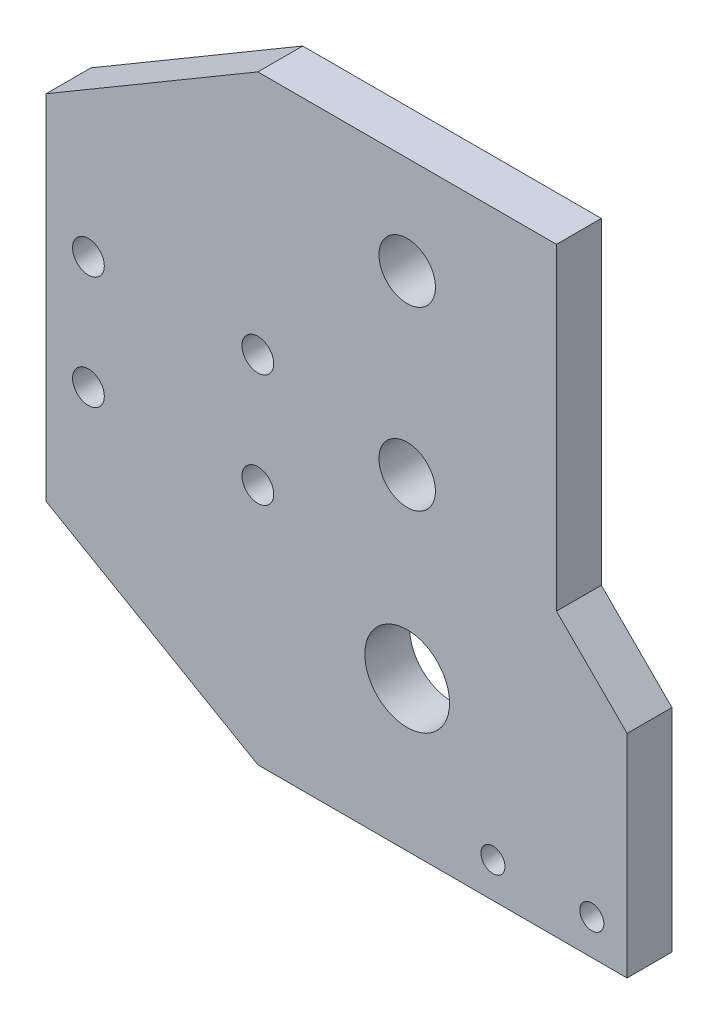
ISO-10303-21;
HEADER;
FILE_DESCRIPTION(('STEP AP214'),'2;1');
FILE_NAME('part.step','',(''),(''),'','','');
FILE_SCHEMA(('AUTOMOTIVE_DESIGN { 1 0 10303 214 1 1 1 1 }'));
ENDSEC;
DATA;
#1=APPLICATION_CONTEXT('core data for automotive mechanical design processes');
#2=APPLICATION_PROTOCOL_DEFINITION('international standard','automotive_design',2000,#1);
#3=PRODUCT_CONTEXT('',#1,'mechanical');
#4=PRODUCT('Part','Part','',(#3));
#5=PRODUCT_RELATED_PRODUCT_CATEGORY('part','',(#4));
#6=PRODUCT_DEFINITION_FORMATION('','',#4);
#7=PRODUCT_DEFINITION_CONTEXT('part definition',#1,'design');
#8=PRODUCT_DEFINITION('design','',#6,#7);
#9=PRODUCT_DEFINITION_SHAPE('','',#8);
#10=(LENGTH_UNIT() NAMED_UNIT(*) SI_UNIT(.MILLI.,.METRE.));
#11=(NAMED_UNIT(*) PLANE_ANGLE_UNIT() SI_UNIT($,.RADIAN.));
#12=(NAMED_UNIT(*) SI_UNIT($,.STERADIAN.) SOLID_ANGLE_UNIT());
#13=UNCERTAINTY_MEASURE_WITH_UNIT(LENGTH_MEASURE(1.E-05),#10,'distance_accuracy_value','');
#14=(GEOMETRIC_REPRESENTATION_CONTEXT(3) GLOBAL_UNCERTAINTY_ASSIGNED_CONTEXT((#13)) GLOBAL_UNIT_ASSIGNED_CONTEXT((#10,
#11,#12)) REPRESENTATION_CONTEXT('',''));
#15=CARTESIAN_POINT('',(0.,0.,0.));
#16=DIRECTION('',(0.,0.,1.));
#17=DIRECTION('',(1.,0.,0.));
#18=AXIS2_PLACEMENT_3D('',#15,#16,#17);
#19=CARTESIAN_POINT('',(21.15,-21.15,6.35));
#20=DIRECTION('',(-1.,0.,0.));
#21=DIRECTION('',(0.,-1.,0.));
#22=AXIS2_PLACEMENT_3D('',#19,#20,#21);
#23=PLANE('',#22);
#24=DIRECTION('',(0.,0.,1.));
#25=VECTOR('',#24,1.);
#26=CARTESIAN_POINT('',(21.15,18.8500000000001,-41.2310562561767));
#27=LINE('',#26,#25);
#28=CARTESIAN_POINT('',(21.15,18.8500000000001,0.));
#29=VERTEX_POINT('',#28);
#30=CARTESIAN_POINT('',(21.15,18.8500000000001,6.35));
#31=VERTEX_POINT('',#30);
#32=EDGE_CURVE('E61',#29,#31,#27,.T.);
#33=ORIENTED_EDGE('',*,*,#32,.F.);
#34=DIRECTION('',(0.,1.,0.));
#35=VECTOR('',#34,1.);
#36=CARTESIAN_POINT('',(21.15,-21.15,0.));
#37=LINE('',#36,#35);
#38=CARTESIAN_POINT('',(21.15,63.85,0.));
#39=VERTEX_POINT('',#38);
#40=EDGE_CURVE('E81',#29,#39,#37,.T.);
#41=ORIENTED_EDGE('',*,*,#40,.T.);
#42=DIRECTION('',(0.,0.,-1.));
#43=VECTOR('',#42,1.);
#44=CARTESIAN_POINT('',(21.15,63.85,6.35));
#45=LINE('',#44,#43);
#46=CARTESIAN_POINT('',(21.15,63.85,6.35));
#47=VERTEX_POINT('',#46);
#48=EDGE_CURVE('E54',#47,#39,#45,.T.);
#49=ORIENTED_EDGE('',*,*,#48,.F.);
#50=DIRECTION('',(0.,1.,0.));
#51=VECTOR('',#50,1.);
#52=CARTESIAN_POINT('',(21.15,-21.15,6.35));
#53=LINE('',#52,#51);
#54=EDGE_CURVE('E234',#31,#47,#53,.T.);
#55=ORIENTED_EDGE('',*,*,#54,.F.);
#56=EDGE_LOOP('',(#33,#41,#49,#55));
#57=FACE_BOUND('',#56,.T.);
#58=ADVANCED_FACE('F45',(#57),#23,.F.);
#59=CARTESIAN_POINT('',(0.,0.,6.35));
#60=DIRECTION('',(0.,0.,-1.));
#61=DIRECTION('',(-1.,0.,0.));
#62=AXIS2_PLACEMENT_3D('',#59,#60,#61);
#63=PLANE('',#62);
#64=CARTESIAN_POINT('',(12.15,-16.15,6.35));
#65=DIRECTION('',(0.,0.,1.));
#66=DIRECTION('',(1.,0.,0.));
#67=AXIS2_PLACEMENT_3D('',#64,#65,#66);
#68=CIRCLE('',#67,1.69999999999999);
#69=CARTESIAN_POINT('',(13.85,-16.15,6.35));
#70=VERTEX_POINT('',#69);
#71=EDGE_CURVE('E443',#70,#70,#68,.T.);
#72=ORIENTED_EDGE('',*,*,#71,.F.);
#73=EDGE_LOOP('',(#72));
#74=FACE_BOUND('',#73,.T.);
#75=CARTESIAN_POINT('',(26.15,-16.15,6.35));
#76=DIRECTION('',(0.,0.,1.));
#77=DIRECTION('',(1.,0.,0.));
#78=AXIS2_PLACEMENT_3D('',#75,#76,#77);
#79=CIRCLE('',#78,1.69999999999999);
#80=CARTESIAN_POINT('',(27.85,-16.15,6.35));
#81=VERTEX_POINT('',#80);
#82=EDGE_CURVE('E447',#81,#81,#79,.T.);
#83=ORIENTED_EDGE('',*,*,#82,.F.);
#84=EDGE_LOOP('',(#83));
#85=FACE_BOUND('',#84,.T.);
#86=CARTESIAN_POINT('',(-21.15,29.170508075689,6.35));
#87=DIRECTION('',(0.,0.,1.));
#88=DIRECTION('',(1.,0.,0.));
#89=AXIS2_PLACEMENT_3D('',#86,#87,#88);
#90=CIRCLE('',#89,2.25);
#91=CARTESIAN_POINT('',(-18.9,29.170508075689,6.35));
#92=VERTEX_POINT('',#91);
#93=EDGE_CURVE('E149',#92,#92,#90,.T.);
#94=ORIENTED_EDGE('',*,*,#93,.F.);
#95=EDGE_LOOP('',(#94));
#96=FACE_BOUND('',#95,.T.);
#97=CARTESIAN_POINT('',(-45.15,13.1705080756889,6.35));
#98=DIRECTION('',(0.,0.,1.));
#99=DIRECTION('',(1.,0.,0.));
#100=AXIS2_PLACEMENT_3D('',#97,#98,#99);
#101=CIRCLE('',#100,2.25);
#102=CARTESIAN_POINT('',(-42.9,13.1705080756889,6.35));
#103=VERTEX_POINT('',#102);
#104=EDGE_CURVE('E157',#103,#103,#101,.T.);
#105=ORIENTED_EDGE('',*,*,#104,.F.);
#106=EDGE_LOOP('',(#105));
#107=FACE_BOUND('',#106,.T.);
#108=CARTESIAN_POINT('',(-45.15,29.170508075689,6.35));
#109=DIRECTION('',(0.,0.,1.));
#110=DIRECTION('',(1.,0.,0.));
#111=AXIS2_PLACEMENT_3D('',#108,#109,#110);
#112=CIRCLE('',#111,2.25);
#113=CARTESIAN_POINT('',(-42.9,29.170508075689,6.35));
#114=VERTEX_POINT('',#113);
#115=EDGE_CURVE('E165',#114,#114,#112,.T.);
#116=ORIENTED_EDGE('',*,*,#115,.F.);
#117=EDGE_LOOP('',(#116));
#118=FACE_BOUND('',#117,.T.);
#119=CARTESIAN_POINT('',(-21.15,13.170508075689,6.35));
#120=DIRECTION('',(0.,0.,1.));
#121=DIRECTION('',(1.,0.,0.));
#122=AXIS2_PLACEMENT_3D('',#119,#120,#121);
#123=CIRCLE('',#122,2.25);
#124=CARTESIAN_POINT('',(-18.9,13.170508075689,6.35));
#125=VERTEX_POINT('',#124);
#126=EDGE_CURVE('E173',#125,#125,#123,.T.);
#127=ORIENTED_EDGE('',*,*,#126,.F.);
#128=EDGE_LOOP('',(#127));
#129=FACE_BOUND('',#128,.T.);
#130=DIRECTION('',(-1.,0.,0.));
#131=VECTOR('',#130,1.);
#132=CARTESIAN_POINT('',(-21.15,63.85,6.35));
#133=LINE('',#132,#131);
#134=CARTESIAN_POINT('',(-21.15,63.85,6.35));
#135=VERTEX_POINT('',#134);
#136=EDGE_CURVE('E70',#47,#135,#133,.T.);
#137=ORIENTED_EDGE('',*,*,#136,.T.);
#138=DIRECTION('',(-0.861526899004657,-0.507711928450986,0.));
#139=VECTOR('',#138,1.);
#140=CARTESIAN_POINT('',(-51.15,46.170508075689,6.35));
#141=LINE('',#140,#139);
#142=CARTESIAN_POINT('',(-51.15,46.170508075689,6.35));
#143=VERTEX_POINT('',#142);
#144=EDGE_CURVE('E181',#135,#143,#141,.T.);
#145=ORIENTED_EDGE('',*,*,#144,.T.);
#146=DIRECTION('',(0.,-1.,0.));
#147=VECTOR('',#146,1.);
#148=CARTESIAN_POINT('',(-51.15,-3.82949192431105,6.35));
#149=LINE('',#148,#147);
#150=CARTESIAN_POINT('',(-51.15,-3.82949192431105,6.35));
#151=VERTEX_POINT('',#150);
#152=EDGE_CURVE('E187',#143,#151,#149,.T.);
#153=ORIENTED_EDGE('',*,*,#152,.T.);
#154=DIRECTION('',(0.866025403784436,-0.500000000000004,0.));
#155=VECTOR('',#154,1.);
#156=CARTESIAN_POINT('',(-21.15,-21.15,6.35));
#157=LINE('',#156,#155);
#158=CARTESIAN_POINT('',(-21.15,-21.15,6.35));
#159=VERTEX_POINT('',#158);
#160=EDGE_CURVE('E182',#151,#159,#157,.T.);
#161=ORIENTED_EDGE('',*,*,#160,.T.);
#162=DIRECTION('',(1.,0.,0.));
#163=VECTOR('',#162,1.);
#164=CARTESIAN_POINT('',(-21.15,-21.15,6.35));
#165=LINE('',#164,#163);
#166=CARTESIAN_POINT('',(31.15,-21.15,6.35));
#167=VERTEX_POINT('',#166);
#168=EDGE_CURVE('E87',#159,#167,#165,.T.);
#169=ORIENTED_EDGE('',*,*,#168,.T.);
#170=DIRECTION('',(0.,1.,0.));
#171=VECTOR('',#170,1.);
#172=CARTESIAN_POINT('',(31.15,-21.15,6.35));
#173=LINE('',#172,#171);
#174=CARTESIAN_POINT('',(31.15,8.85,6.35));
#175=VERTEX_POINT('',#174);
#176=EDGE_CURVE('E139',#167,#175,#173,.T.);
#177=ORIENTED_EDGE('',*,*,#176,.T.);
#178=DIRECTION('',(-0.707106781186544,0.707106781186551,0.));
#179=VECTOR('',#178,1.);
#180=CARTESIAN_POINT('',(31.15,8.85,6.35));
#181=LINE('',#180,#179);
#182=EDGE_CURVE('E141',#175,#31,#181,.T.);
#183=ORIENTED_EDGE('',*,*,#182,.T.);
#184=ORIENTED_EDGE('',*,*,#54,.T.);
#185=EDGE_LOOP('',(#137,#145,#153,#161,#169,#177,#183,#184));
#186=FACE_BOUND('',#185,.T.);
#187=CARTESIAN_POINT('',(0.,0.,6.35));
#188=DIRECTION('',(0.,0.,1.));
#189=DIRECTION('',(1.,0.,0.));
#190=AXIS2_PLACEMENT_3D('',#187,#188,#189);
#191=CIRCLE('',#190,6.);
#192=CARTESIAN_POINT('',(6.,0.,6.35));
#193=VERTEX_POINT('',#192);
#194=EDGE_CURVE('E124',#193,#193,#191,.T.);
#195=ORIENTED_EDGE('',*,*,#194,.F.);
#196=EDGE_LOOP('',(#195));
#197=FACE_BOUND('',#196,.T.);
#198=CARTESIAN_POINT('',(0.,25.,6.35));
#199=DIRECTION('',(0.,0.,1.));
#200=DIRECTION('',(1.,0.,0.));
#201=AXIS2_PLACEMENT_3D('',#198,#199,#200);
#202=CIRCLE('',#201,4.);
#203=CARTESIAN_POINT('',(4.,25.,6.35));
#204=VERTEX_POINT('',#203);
#205=EDGE_CURVE('E218',#204,#204,#202,.T.);
#206=ORIENTED_EDGE('',*,*,#205,.F.);
#207=EDGE_LOOP('',(#206));
#208=FACE_BOUND('',#207,.T.);
#209=CARTESIAN_POINT('',(0.,50.,6.35));
#210=DIRECTION('',(0.,0.,1.));
#211=DIRECTION('',(1.,0.,0.));
#212=AXIS2_PLACEMENT_3D('',#209,#210,#211);
#213=CIRCLE('',#212,4.);
#214=CARTESIAN_POINT('',(4.,50.,6.35));
#215=VERTEX_POINT('',#214);
#216=EDGE_CURVE('E210',#215,#215,#213,.T.);
#217=ORIENTED_EDGE('',*,*,#216,.F.);
#218=EDGE_LOOP('',(#217));
#219=FACE_BOUND('',#218,.T.);
#220=ADVANCED_FACE('F257',(#74,#85,#96,#107,#118,#129,#186,#197,#208,#219),#63,.F.);
#221=CARTESIAN_POINT('',(0.,0.,0.));
#222=DIRECTION('',(0.,0.,-1.));
#223=DIRECTION('',(-1.,0.,0.));
#224=AXIS2_PLACEMENT_3D('',#221,#222,#223);
#225=PLANE('',#224);
#226=CARTESIAN_POINT('',(12.15,-16.15,0.));
#227=DIRECTION('',(0.,0.,1.));
#228=DIRECTION('',(1.,0.,0.));
#229=AXIS2_PLACEMENT_3D('',#226,#227,#228);
#230=CIRCLE('',#229,1.7);
#231=CARTESIAN_POINT('',(13.85,-16.15,0.));
#232=VERTEX_POINT('',#231);
#233=EDGE_CURVE('E440',#232,#232,#230,.T.);
#234=ORIENTED_EDGE('',*,*,#233,.T.);
#235=EDGE_LOOP('',(#234));
#236=FACE_BOUND('',#235,.T.);
#237=CARTESIAN_POINT('',(26.15,-16.15,0.));
#238=DIRECTION('',(0.,0.,1.));
#239=DIRECTION('',(1.,0.,0.));
#240=AXIS2_PLACEMENT_3D('',#237,#238,#239);
#241=CIRCLE('',#240,1.7);
#242=CARTESIAN_POINT('',(27.85,-16.15,0.));
#243=VERTEX_POINT('',#242);
#244=EDGE_CURVE('E453',#243,#243,#241,.T.);
#245=ORIENTED_EDGE('',*,*,#244,.T.);
#246=EDGE_LOOP('',(#245));
#247=FACE_BOUND('',#246,.T.);
#248=CARTESIAN_POINT('',(-21.15,29.170508075689,0.));
#249=DIRECTION('',(0.,0.,1.));
#250=DIRECTION('',(1.,0.,0.));
#251=AXIS2_PLACEMENT_3D('',#248,#249,#250);
#252=CIRCLE('',#251,2.25);
#253=CARTESIAN_POINT('',(-18.9,29.170508075689,0.));
#254=VERTEX_POINT('',#253);
#255=EDGE_CURVE('E153',#254,#254,#252,.T.);
#256=ORIENTED_EDGE('',*,*,#255,.T.);
#257=EDGE_LOOP('',(#256));
#258=FACE_BOUND('',#257,.T.);
#259=CARTESIAN_POINT('',(-45.15,13.1705080756889,0.));
#260=DIRECTION('',(0.,0.,1.));
#261=DIRECTION('',(1.,0.,0.));
#262=AXIS2_PLACEMENT_3D('',#259,#260,#261);
#263=CIRCLE('',#262,2.25);
#264=CARTESIAN_POINT('',(-42.9,13.1705080756889,0.));
#265=VERTEX_POINT('',#264);
#266=EDGE_CURVE('E161',#265,#265,#263,.T.);
#267=ORIENTED_EDGE('',*,*,#266,.T.);
#268=EDGE_LOOP('',(#267));
#269=FACE_BOUND('',#268,.T.);
#270=CARTESIAN_POINT('',(-45.15,29.170508075689,0.));
#271=DIRECTION('',(0.,0.,1.));
#272=DIRECTION('',(1.,0.,0.));
#273=AXIS2_PLACEMENT_3D('',#270,#271,#272);
#274=CIRCLE('',#273,2.25);
#275=CARTESIAN_POINT('',(-42.9,29.170508075689,0.));
#276=VERTEX_POINT('',#275);
#277=EDGE_CURVE('E169',#276,#276,#274,.T.);
#278=ORIENTED_EDGE('',*,*,#277,.T.);
#279=EDGE_LOOP('',(#278));
#280=FACE_BOUND('',#279,.T.);
#281=CARTESIAN_POINT('',(-21.15,13.170508075689,0.));
#282=DIRECTION('',(0.,0.,1.));
#283=DIRECTION('',(1.,0.,0.));
#284=AXIS2_PLACEMENT_3D('',#281,#282,#283);
#285=CIRCLE('',#284,2.25);
#286=CARTESIAN_POINT('',(-18.9,13.170508075689,0.));
#287=VERTEX_POINT('',#286);
#288=EDGE_CURVE('E177',#287,#287,#285,.T.);
#289=ORIENTED_EDGE('',*,*,#288,.T.);
#290=EDGE_LOOP('',(#289));
#291=FACE_BOUND('',#290,.T.);
#292=CARTESIAN_POINT('',(0.,25.,0.));
#293=DIRECTION('',(0.,0.,1.));
#294=DIRECTION('',(1.,0.,0.));
#295=AXIS2_PLACEMENT_3D('',#292,#293,#294);
#296=CIRCLE('',#295,4.);
#297=CARTESIAN_POINT('',(4.,25.,0.));
#298=VERTEX_POINT('',#297);
#299=EDGE_CURVE('E214',#298,#298,#296,.T.);
#300=ORIENTED_EDGE('',*,*,#299,.T.);
#301=EDGE_LOOP('',(#300));
#302=FACE_BOUND('',#301,.T.);
#303=DIRECTION('',(1.,0.,0.));
#304=VECTOR('',#303,1.);
#305=CARTESIAN_POINT('',(-21.15,-21.15,0.));
#306=LINE('',#305,#304);
#307=CARTESIAN_POINT('',(-21.15,-21.15,0.));
#308=VERTEX_POINT('',#307);
#309=CARTESIAN_POINT('',(31.15,-21.15,0.));
#310=VERTEX_POINT('',#309);
#311=EDGE_CURVE('E116',#308,#310,#306,.T.);
#312=ORIENTED_EDGE('',*,*,#311,.F.);
#313=DIRECTION('',(0.866025403784436,-0.500000000000004,0.));
#314=VECTOR('',#313,1.);
#315=CARTESIAN_POINT('',(-21.15,-21.15,0.));
#316=LINE('',#315,#314);
#317=CARTESIAN_POINT('',(-51.15,-3.82949192431105,0.));
#318=VERTEX_POINT('',#317);
#319=EDGE_CURVE('E197',#318,#308,#316,.T.);
#320=ORIENTED_EDGE('',*,*,#319,.F.);
#321=DIRECTION('',(0.,-1.,0.));
#322=VECTOR('',#321,1.);
#323=CARTESIAN_POINT('',(-51.15,-3.82949192431105,0.));
#324=LINE('',#323,#322);
#325=CARTESIAN_POINT('',(-51.15,46.170508075689,0.));
#326=VERTEX_POINT('',#325);
#327=EDGE_CURVE('E202',#326,#318,#324,.T.);
#328=ORIENTED_EDGE('',*,*,#327,.F.);
#329=DIRECTION('',(-0.861526899004657,-0.507711928450986,0.));
#330=VECTOR('',#329,1.);
#331=CARTESIAN_POINT('',(-51.15,46.170508075689,0.));
#332=LINE('',#331,#330);
#333=CARTESIAN_POINT('',(-21.15,63.85,0.));
#334=VERTEX_POINT('',#333);
#335=EDGE_CURVE('E186',#334,#326,#332,.T.);
#336=ORIENTED_EDGE('',*,*,#335,.F.);
#337=DIRECTION('',(-1.,0.,0.));
#338=VECTOR('',#337,1.);
#339=CARTESIAN_POINT('',(-21.15,63.85,0.));
#340=LINE('',#339,#338);
#341=EDGE_CURVE('E235',#39,#334,#340,.T.);
#342=ORIENTED_EDGE('',*,*,#341,.F.);
#343=ORIENTED_EDGE('',*,*,#40,.F.);
#344=DIRECTION('',(-0.707106781186544,0.707106781186551,0.));
#345=VECTOR('',#344,1.);
#346=CARTESIAN_POINT('',(31.15,8.85,0.));
#347=LINE('',#346,#345);
#348=CARTESIAN_POINT('',(31.15,8.85,0.));
#349=VERTEX_POINT('',#348);
#350=EDGE_CURVE('E131',#349,#29,#347,.T.);
#351=ORIENTED_EDGE('',*,*,#350,.F.);
#352=DIRECTION('',(0.,1.,0.));
#353=VECTOR('',#352,1.);
#354=CARTESIAN_POINT('',(31.15,-21.15,0.));
#355=LINE('',#354,#353);
#356=EDGE_CURVE('E127',#310,#349,#355,.T.);
#357=ORIENTED_EDGE('',*,*,#356,.F.);
#358=EDGE_LOOP('',(#312,#320,#328,#336,#342,#343,#351,#357));
#359=FACE_BOUND('',#358,.T.);
#360=CARTESIAN_POINT('',(0.,0.,0.));
#361=DIRECTION('',(0.,0.,1.));
#362=DIRECTION('',(1.,0.,0.));
#363=AXIS2_PLACEMENT_3D('',#360,#361,#362);
#364=CIRCLE('',#363,6.);
#365=CARTESIAN_POINT('',(6.,0.,0.));
#366=VERTEX_POINT('',#365);
#367=EDGE_CURVE('E222',#366,#366,#364,.T.);
#368=ORIENTED_EDGE('',*,*,#367,.T.);
#369=EDGE_LOOP('',(#368));
#370=FACE_BOUND('',#369,.T.);
#371=CARTESIAN_POINT('',(0.,50.,0.));
#372=DIRECTION('',(0.,0.,1.));
#373=DIRECTION('',(1.,0.,0.));
#374=AXIS2_PLACEMENT_3D('',#371,#372,#373);
#375=CIRCLE('',#374,4.);
#376=CARTESIAN_POINT('',(4.,50.,0.));
#377=VERTEX_POINT('',#376);
#378=EDGE_CURVE('E200',#377,#377,#375,.T.);
#379=ORIENTED_EDGE('',*,*,#378,.T.);
#380=EDGE_LOOP('',(#379));
#381=FACE_BOUND('',#380,.T.);
#382=ADVANCED_FACE('F128',(#236,#247,#258,#269,#280,#291,#302,#359,#370,#381),#225,.T.);
#383=CARTESIAN_POINT('',(-21.15,-21.15,6.35));
#384=DIRECTION('',(0.,1.,0.));
#385=DIRECTION('',(-1.,0.,0.));
#386=AXIS2_PLACEMENT_3D('',#383,#384,#385);
#387=PLANE('',#386);
#388=ORIENTED_EDGE('',*,*,#311,.T.);
#389=DIRECTION('',(0.,0.,1.));
#390=VECTOR('',#389,1.);
#391=CARTESIAN_POINT('',(31.15,-21.15,-41.2310562561767));
#392=LINE('',#391,#390);
#393=EDGE_CURVE('E119',#310,#167,#392,.T.);
#394=ORIENTED_EDGE('',*,*,#393,.T.);
#395=ORIENTED_EDGE('',*,*,#168,.F.);
#396=DIRECTION('',(0.,0.,-1.));
#397=VECTOR('',#396,1.);
#398=CARTESIAN_POINT('',(-21.15,-21.15,6.35));
#399=LINE('',#398,#397);
#400=EDGE_CURVE('E11',#159,#308,#399,.T.);
#401=ORIENTED_EDGE('',*,*,#400,.T.);
#402=EDGE_LOOP('',(#388,#394,#395,#401));
#403=FACE_BOUND('',#402,.T.);
#404=ADVANCED_FACE('F47',(#403),#387,.F.);
#405=CARTESIAN_POINT('',(-21.15,63.85,6.35));
#406=DIRECTION('',(0.,-1.,0.));
#407=DIRECTION('',(0.,0.,-1.));
#408=AXIS2_PLACEMENT_3D('',#405,#406,#407);
#409=PLANE('',#408);
#410=ORIENTED_EDGE('',*,*,#341,.T.);
#411=DIRECTION('',(0.,0.,-1.));
#412=VECTOR('',#411,1.);
#413=CARTESIAN_POINT('',(-21.15,63.85,6.35));
#414=LINE('',#413,#412);
#415=EDGE_CURVE('E239',#135,#334,#414,.T.);
#416=ORIENTED_EDGE('',*,*,#415,.F.);
#417=ORIENTED_EDGE('',*,*,#136,.F.);
#418=ORIENTED_EDGE('',*,*,#48,.T.);
#419=EDGE_LOOP('',(#410,#416,#417,#418));
#420=FACE_BOUND('',#419,.T.);
#421=ADVANCED_FACE('F250',(#420),#409,.F.);
#422=CARTESIAN_POINT('',(0.,0.,6.35));
#423=DIRECTION('',(0.,0.,-1.));
#424=DIRECTION('',(-1.,0.,0.));
#425=AXIS2_PLACEMENT_3D('',#422,#423,#424);
#426=CYLINDRICAL_SURFACE('',#425,6.);
#427=ORIENTED_EDGE('',*,*,#194,.T.);
#428=EDGE_LOOP('',(#427));
#429=FACE_BOUND('',#428,.T.);
#430=ORIENTED_EDGE('',*,*,#367,.F.);
#431=EDGE_LOOP('',(#430));
#432=FACE_BOUND('',#431,.T.);
#433=ADVANCED_FACE('F286',(#429,#432),#426,.F.);
#434=CARTESIAN_POINT('',(0.,25.,6.35));
#435=DIRECTION('',(0.,0.,-1.));
#436=DIRECTION('',(-1.,0.,0.));
#437=AXIS2_PLACEMENT_3D('',#434,#435,#436);
#438=CYLINDRICAL_SURFACE('',#437,4.);
#439=ORIENTED_EDGE('',*,*,#205,.T.);
#440=EDGE_LOOP('',(#439));
#441=FACE_BOUND('',#440,.T.);
#442=ORIENTED_EDGE('',*,*,#299,.F.);
#443=EDGE_LOOP('',(#442));
#444=FACE_BOUND('',#443,.T.);
#445=ADVANCED_FACE('F292',(#441,#444),#438,.F.);
#446=CARTESIAN_POINT('',(0.,50.,6.35));
#447=DIRECTION('',(0.,0.,-1.));
#448=DIRECTION('',(-1.,0.,0.));
#449=AXIS2_PLACEMENT_3D('',#446,#447,#448);
#450=CYLINDRICAL_SURFACE('',#449,4.);
#451=ORIENTED_EDGE('',*,*,#216,.T.);
#452=EDGE_LOOP('',(#451));
#453=FACE_BOUND('',#452,.T.);
#454=ORIENTED_EDGE('',*,*,#378,.F.);
#455=EDGE_LOOP('',(#454));
#456=FACE_BOUND('',#455,.T.);
#457=ADVANCED_FACE('F273',(#453,#456),#450,.F.);
#458=CARTESIAN_POINT('',(-51.15,46.170508075689,-90.1387818865997));
#459=DIRECTION('',(-0.507711928450986,0.861526899004657,0.));
#460=DIRECTION('',(-0.861526899004657,-0.507711928450986,0.));
#461=AXIS2_PLACEMENT_3D('',#458,#459,#460);
#462=PLANE('',#461);
#463=ORIENTED_EDGE('',*,*,#415,.T.);
#464=ORIENTED_EDGE('',*,*,#335,.T.);
#465=DIRECTION('',(0.,0.,1.));
#466=VECTOR('',#465,1.);
#467=CARTESIAN_POINT('',(-51.15,46.170508075689,-90.1387818865997));
#468=LINE('',#467,#466);
#469=EDGE_CURVE('E196',#326,#143,#468,.T.);
#470=ORIENTED_EDGE('',*,*,#469,.T.);
#471=ORIENTED_EDGE('',*,*,#144,.F.);
#472=EDGE_LOOP('',(#463,#464,#470,#471));
#473=FACE_BOUND('',#472,.T.);
#474=ADVANCED_FACE('F255',(#473),#462,.T.);
#475=CARTESIAN_POINT('',(-51.15,-3.82949192431105,-90.1387818865997));
#476=DIRECTION('',(-1.,0.,0.));
#477=DIRECTION('',(0.,-1.,0.));
#478=AXIS2_PLACEMENT_3D('',#475,#476,#477);
#479=PLANE('',#478);
#480=ORIENTED_EDGE('',*,*,#469,.F.);
#481=ORIENTED_EDGE('',*,*,#327,.T.);
#482=DIRECTION('',(0.,0.,1.));
#483=VECTOR('',#482,1.);
#484=CARTESIAN_POINT('',(-51.15,-3.82949192431105,-90.1387818865997));
#485=LINE('',#484,#483);
#486=EDGE_CURVE('E201',#318,#151,#485,.T.);
#487=ORIENTED_EDGE('',*,*,#486,.T.);
#488=ORIENTED_EDGE('',*,*,#152,.F.);
#489=EDGE_LOOP('',(#480,#481,#487,#488));
#490=FACE_BOUND('',#489,.T.);
#491=ADVANCED_FACE('F264',(#490),#479,.T.);
#492=CARTESIAN_POINT('',(-21.15,-21.15,-90.1387818865997));
#493=DIRECTION('',(-0.500000000000004,-0.866025403784436,0.));
#494=DIRECTION('',(0.866025403784436,-0.500000000000004,0.));
#495=AXIS2_PLACEMENT_3D('',#492,#493,#494);
#496=PLANE('',#495);
#497=ORIENTED_EDGE('',*,*,#486,.F.);
#498=ORIENTED_EDGE('',*,*,#319,.T.);
#499=ORIENTED_EDGE('',*,*,#400,.F.);
#500=ORIENTED_EDGE('',*,*,#160,.F.);
#501=EDGE_LOOP('',(#497,#498,#499,#500));
#502=FACE_BOUND('',#501,.T.);
#503=ADVANCED_FACE('F263',(#502),#496,.T.);
#504=CARTESIAN_POINT('',(-21.15,13.170508075689,6.35));
#505=DIRECTION('',(0.,0.,1.));
#506=DIRECTION('',(1.,0.,0.));
#507=AXIS2_PLACEMENT_3D('',#504,#505,#506);
#508=CYLINDRICAL_SURFACE('',#507,2.25);
#509=ORIENTED_EDGE('',*,*,#288,.F.);
#510=EDGE_LOOP('',(#509));
#511=FACE_BOUND('',#510,.T.);
#512=ORIENTED_EDGE('',*,*,#126,.T.);
#513=EDGE_LOOP('',(#512));
#514=FACE_BOUND('',#513,.T.);
#515=ADVANCED_FACE('F271',(#511,#514),#508,.F.);
#516=CARTESIAN_POINT('',(-45.15,29.170508075689,6.35));
#517=DIRECTION('',(0.,0.,1.));
#518=DIRECTION('',(1.,0.,0.));
#519=AXIS2_PLACEMENT_3D('',#516,#517,#518);
#520=CYLINDRICAL_SURFACE('',#519,2.25);
#521=ORIENTED_EDGE('',*,*,#277,.F.);
#522=EDGE_LOOP('',(#521));
#523=FACE_BOUND('',#522,.T.);
#524=ORIENTED_EDGE('',*,*,#115,.T.);
#525=EDGE_LOOP('',(#524));
#526=FACE_BOUND('',#525,.T.);
#527=ADVANCED_FACE('F346',(#523,#526),#520,.F.);
#528=CARTESIAN_POINT('',(-45.15,13.1705080756889,6.35));
#529=DIRECTION('',(0.,0.,1.));
#530=DIRECTION('',(1.,0.,0.));
#531=AXIS2_PLACEMENT_3D('',#528,#529,#530);
#532=CYLINDRICAL_SURFACE('',#531,2.25);
#533=ORIENTED_EDGE('',*,*,#266,.F.);
#534=EDGE_LOOP('',(#533));
#535=FACE_BOUND('',#534,.T.);
#536=ORIENTED_EDGE('',*,*,#104,.T.);
#537=EDGE_LOOP('',(#536));
#538=FACE_BOUND('',#537,.T.);
#539=ADVANCED_FACE('F356',(#535,#538),#532,.F.);
#540=CARTESIAN_POINT('',(-21.15,29.170508075689,6.35));
#541=DIRECTION('',(0.,0.,1.));
#542=DIRECTION('',(1.,0.,0.));
#543=AXIS2_PLACEMENT_3D('',#540,#541,#542);
#544=CYLINDRICAL_SURFACE('',#543,2.25);
#545=ORIENTED_EDGE('',*,*,#255,.F.);
#546=EDGE_LOOP('',(#545));
#547=FACE_BOUND('',#546,.T.);
#548=ORIENTED_EDGE('',*,*,#93,.T.);
#549=EDGE_LOOP('',(#548));
#550=FACE_BOUND('',#549,.T.);
#551=ADVANCED_FACE('F366',(#547,#550),#544,.F.);
#552=CARTESIAN_POINT('',(31.15,-21.15,-41.2310562561767));
#553=DIRECTION('',(1.,0.,0.));
#554=DIRECTION('',(0.,0.,-1.));
#555=AXIS2_PLACEMENT_3D('',#552,#553,#554);
#556=PLANE('',#555);
#557=ORIENTED_EDGE('',*,*,#393,.F.);
#558=ORIENTED_EDGE('',*,*,#356,.T.);
#559=DIRECTION('',(0.,0.,1.));
#560=VECTOR('',#559,1.);
#561=CARTESIAN_POINT('',(31.15,8.85,-41.2310562561767));
#562=LINE('',#561,#560);
#563=EDGE_CURVE('E135',#349,#175,#562,.T.);
#564=ORIENTED_EDGE('',*,*,#563,.T.);
#565=ORIENTED_EDGE('',*,*,#176,.F.);
#566=EDGE_LOOP('',(#557,#558,#564,#565));
#567=FACE_BOUND('',#566,.T.);
#568=ADVANCED_FACE('F137',(#567),#556,.T.);
#569=CARTESIAN_POINT('',(31.15,8.85,-41.2310562561767));
#570=DIRECTION('',(0.707106781186551,0.707106781186544,0.));
#571=DIRECTION('',(-0.707106781186544,0.707106781186551,0.));
#572=AXIS2_PLACEMENT_3D('',#569,#570,#571);
#573=PLANE('',#572);
#574=ORIENTED_EDGE('',*,*,#563,.F.);
#575=ORIENTED_EDGE('',*,*,#350,.T.);
#576=ORIENTED_EDGE('',*,*,#32,.T.);
#577=ORIENTED_EDGE('',*,*,#182,.F.);
#578=EDGE_LOOP('',(#574,#575,#576,#577));
#579=FACE_BOUND('',#578,.T.);
#580=ADVANCED_FACE('F407',(#579),#573,.T.);
#581=CARTESIAN_POINT('',(26.15,-16.15,6.35));
#582=DIRECTION('',(0.,0.,1.));
#583=DIRECTION('',(1.,0.,0.));
#584=AXIS2_PLACEMENT_3D('',#581,#582,#583);
#585=CYLINDRICAL_SURFACE('',#584,1.69999999999999);
#586=ORIENTED_EDGE('',*,*,#244,.F.);
#587=EDGE_LOOP('',(#586));
#588=FACE_BOUND('',#587,.T.);
#589=ORIENTED_EDGE('',*,*,#82,.T.);
#590=EDGE_LOOP('',(#589));
#591=FACE_BOUND('',#590,.T.);
#592=ADVANCED_FACE('F415',(#588,#591),#585,.F.);
#593=CARTESIAN_POINT('',(12.15,-16.15,6.35));
#594=DIRECTION('',(0.,0.,1.));
#595=DIRECTION('',(1.,0.,0.));
#596=AXIS2_PLACEMENT_3D('',#593,#594,#595);
#597=CYLINDRICAL_SURFACE('',#596,1.69999999999999);
#598=ORIENTED_EDGE('',*,*,#233,.F.);
#599=EDGE_LOOP('',(#598));
#600=FACE_BOUND('',#599,.T.);
#601=ORIENTED_EDGE('',*,*,#71,.T.);
#602=EDGE_LOOP('',(#601));
#603=FACE_BOUND('',#602,.T.);
#604=ADVANCED_FACE('F424',(#600,#603),#597,.F.);
#605=CLOSED_SHELL('',(#58,#220,#382,#404,#421,#433,#445,#457,#474,#491,#503,#515,#527,#539,#551,
#568,#580,#592,#604));
#606=MANIFOLD_SOLID_BREP('B2',#605);
#607=ADVANCED_BREP_SHAPE_REPRESENTATION('',(#18,#606),#14);
#608=SHAPE_DEFINITION_REPRESENTATION(#9,#607);
ENDSEC;
END-ISO-10303-21;
